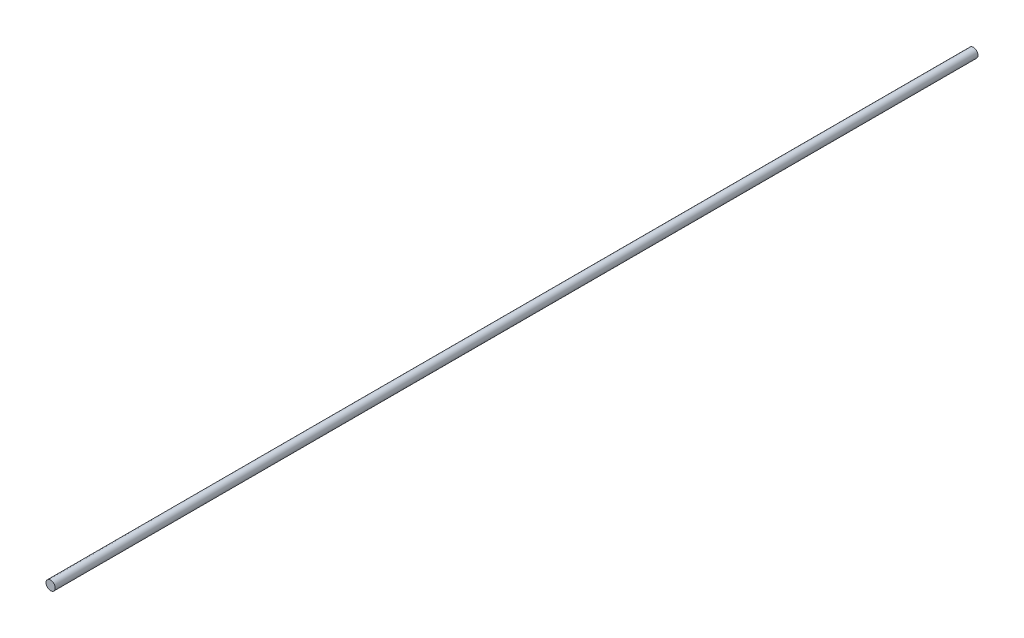
ISO-10303-21;
HEADER;
FILE_DESCRIPTION(('STEP AP214'),'2;1');
FILE_NAME('part.step','',(''),(''),'','','');
FILE_SCHEMA(('AUTOMOTIVE_DESIGN { 1 0 10303 214 1 1 1 1 }'));
ENDSEC;
DATA;
#1=APPLICATION_CONTEXT('core data for automotive mechanical design processes');
#2=APPLICATION_PROTOCOL_DEFINITION('international standard','automotive_design',2000,#1);
#3=PRODUCT_CONTEXT('',#1,'mechanical');
#4=PRODUCT('Part','Part','',(#3));
#5=PRODUCT_RELATED_PRODUCT_CATEGORY('part','',(#4));
#6=PRODUCT_DEFINITION_FORMATION('','',#4);
#7=PRODUCT_DEFINITION_CONTEXT('part definition',#1,'design');
#8=PRODUCT_DEFINITION('design','',#6,#7);
#9=PRODUCT_DEFINITION_SHAPE('','',#8);
#10=(LENGTH_UNIT() NAMED_UNIT(*) SI_UNIT(.MILLI.,.METRE.));
#11=(NAMED_UNIT(*) PLANE_ANGLE_UNIT() SI_UNIT($,.RADIAN.));
#12=(NAMED_UNIT(*) SI_UNIT($,.STERADIAN.) SOLID_ANGLE_UNIT());
#13=UNCERTAINTY_MEASURE_WITH_UNIT(LENGTH_MEASURE(1.E-05),#10,'distance_accuracy_value','');
#14=(GEOMETRIC_REPRESENTATION_CONTEXT(3) GLOBAL_UNCERTAINTY_ASSIGNED_CONTEXT((#13)) GLOBAL_UNIT_ASSIGNED_CONTEXT((#10,
#11,#12)) REPRESENTATION_CONTEXT('',''));
#15=CARTESIAN_POINT('',(0.,0.,0.));
#16=DIRECTION('',(0.,0.,1.));
#17=DIRECTION('',(1.,0.,0.));
#18=AXIS2_PLACEMENT_3D('',#15,#16,#17);
#19=CARTESIAN_POINT('',(0.,0.,500.));
#20=DIRECTION('',(0.,0.,-1.));
#21=DIRECTION('',(-1.,0.,0.));
#22=AXIS2_PLACEMENT_3D('',#19,#20,#21);
#23=CYLINDRICAL_SURFACE('',#22,2.5);
#24=CARTESIAN_POINT('',(0.,0.,500.));
#25=DIRECTION('',(0.,0.,1.));
#26=DIRECTION('',(1.,0.,0.));
#27=AXIS2_PLACEMENT_3D('',#24,#25,#26);
#28=CIRCLE('',#27,2.5);
#29=CARTESIAN_POINT('',(2.5,0.,500.));
#30=VERTEX_POINT('',#29);
#31=EDGE_CURVE('E12',#30,#30,#28,.T.);
#32=ORIENTED_EDGE('',*,*,#31,.F.);
#33=EDGE_LOOP('',(#32));
#34=FACE_BOUND('',#33,.T.);
#35=CARTESIAN_POINT('',(0.,0.,0.));
#36=DIRECTION('',(0.,0.,1.));
#37=DIRECTION('',(1.,0.,0.));
#38=AXIS2_PLACEMENT_3D('',#35,#36,#37);
#39=CIRCLE('',#38,2.5);
#40=CARTESIAN_POINT('',(2.5,0.,0.));
#41=VERTEX_POINT('',#40);
#42=EDGE_CURVE('E44',#41,#41,#39,.T.);
#43=ORIENTED_EDGE('',*,*,#42,.T.);
#44=EDGE_LOOP('',(#43));
#45=FACE_BOUND('',#44,.T.);
#46=ADVANCED_FACE('F41',(#34,#45),#23,.T.);
#47=CARTESIAN_POINT('',(0.,0.,500.));
#48=DIRECTION('',(0.,0.,1.));
#49=DIRECTION('',(1.,0.,0.));
#50=AXIS2_PLACEMENT_3D('',#47,#48,#49);
#51=PLANE('',#50);
#52=ORIENTED_EDGE('',*,*,#31,.T.);
#53=EDGE_LOOP('',(#52));
#54=FACE_BOUND('',#53,.T.);
#55=ADVANCED_FACE('F56',(#54),#51,.T.);
#56=CARTESIAN_POINT('',(0.,0.,0.));
#57=DIRECTION('',(0.,0.,1.));
#58=DIRECTION('',(1.,0.,0.));
#59=AXIS2_PLACEMENT_3D('',#56,#57,#58);
#60=PLANE('',#59);
#61=ORIENTED_EDGE('',*,*,#42,.F.);
#62=EDGE_LOOP('',(#61));
#63=FACE_BOUND('',#62,.T.);
#64=ADVANCED_FACE('F54',(#63),#60,.F.);
#65=CLOSED_SHELL('',(#46,#55,#64));
#66=MANIFOLD_SOLID_BREP('B2',#65);
#67=ADVANCED_BREP_SHAPE_REPRESENTATION('',(#18,#66),#14);
#68=SHAPE_DEFINITION_REPRESENTATION(#9,#67);
ENDSEC;
END-ISO-10303-21;
